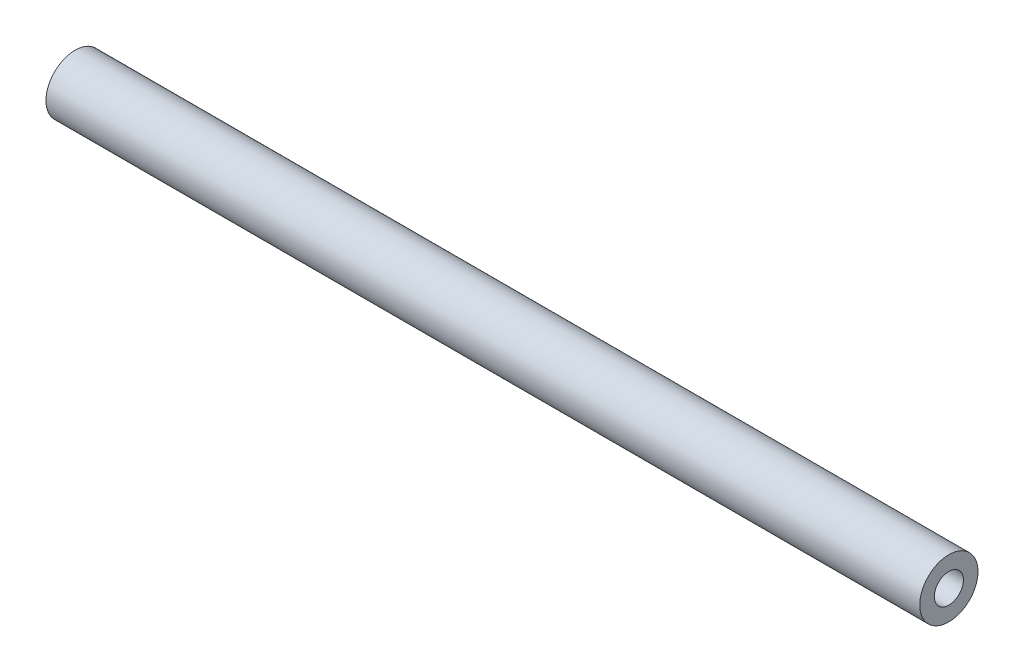
ISO-10303-21;
HEADER;
FILE_DESCRIPTION(('STEP AP214'),'2;1');
FILE_NAME('part.step','',(''),(''),'','','');
FILE_SCHEMA(('AUTOMOTIVE_DESIGN { 1 0 10303 214 1 1 1 1 }'));
ENDSEC;
DATA;
#1=APPLICATION_CONTEXT('core data for automotive mechanical design processes');
#2=APPLICATION_PROTOCOL_DEFINITION('international standard','automotive_design',2000,#1);
#3=PRODUCT_CONTEXT('',#1,'mechanical');
#4=PRODUCT('Part','Part','',(#3));
#5=PRODUCT_RELATED_PRODUCT_CATEGORY('part','',(#4));
#6=PRODUCT_DEFINITION_FORMATION('','',#4);
#7=PRODUCT_DEFINITION_CONTEXT('part definition',#1,'design');
#8=PRODUCT_DEFINITION('design','',#6,#7);
#9=PRODUCT_DEFINITION_SHAPE('','',#8);
#10=(LENGTH_UNIT() NAMED_UNIT(*) SI_UNIT(.MILLI.,.METRE.));
#11=(NAMED_UNIT(*) PLANE_ANGLE_UNIT() SI_UNIT($,.RADIAN.));
#12=(NAMED_UNIT(*) SI_UNIT($,.STERADIAN.) SOLID_ANGLE_UNIT());
#13=UNCERTAINTY_MEASURE_WITH_UNIT(LENGTH_MEASURE(1.E-05),#10,'distance_accuracy_value','');
#14=(GEOMETRIC_REPRESENTATION_CONTEXT(3) GLOBAL_UNCERTAINTY_ASSIGNED_CONTEXT((#13)) GLOBAL_UNIT_ASSIGNED_CONTEXT((#10,
#11,#12)) REPRESENTATION_CONTEXT('',''));
#15=CARTESIAN_POINT('',(0.,0.,0.));
#16=DIRECTION('',(0.,0.,1.));
#17=DIRECTION('',(1.,0.,0.));
#18=AXIS2_PLACEMENT_3D('',#15,#16,#17);
#19=CARTESIAN_POINT('',(75.,0.,0.));
#20=DIRECTION('',(1.,0.,0.));
#21=DIRECTION('',(0.,0.,-1.));
#22=AXIS2_PLACEMENT_3D('',#19,#20,#21);
#23=PLANE('',#22);
#24=CARTESIAN_POINT('',(75.,0.,0.));
#25=DIRECTION('',(1.,0.,0.));
#26=DIRECTION('',(0.,0.,-1.));
#27=AXIS2_PLACEMENT_3D('',#24,#25,#26);
#28=CIRCLE('',#27,5.);
#29=CARTESIAN_POINT('',(75.,0.,-5.));
#30=VERTEX_POINT('',#29);
#31=EDGE_CURVE('E10',#30,#30,#28,.T.);
#32=ORIENTED_EDGE('',*,*,#31,.T.);
#33=EDGE_LOOP('',(#32));
#34=FACE_BOUND('',#33,.T.);
#35=CARTESIAN_POINT('',(75.,0.,0.));
#36=DIRECTION('',(1.,0.,0.));
#37=DIRECTION('',(0.,0.,-1.));
#38=AXIS2_PLACEMENT_3D('',#35,#36,#37);
#39=CIRCLE('',#38,2.5);
#40=CARTESIAN_POINT('',(75.,0.,-2.5));
#41=VERTEX_POINT('',#40);
#42=EDGE_CURVE('E54',#41,#41,#39,.T.);
#43=ORIENTED_EDGE('',*,*,#42,.F.);
#44=EDGE_LOOP('',(#43));
#45=FACE_BOUND('',#44,.T.);
#46=ADVANCED_FACE('F41',(#34,#45),#23,.T.);
#47=CARTESIAN_POINT('',(-75.,0.,0.));
#48=DIRECTION('',(1.,0.,0.));
#49=DIRECTION('',(0.,0.,-1.));
#50=AXIS2_PLACEMENT_3D('',#47,#48,#49);
#51=PLANE('',#50);
#52=CARTESIAN_POINT('',(-75.,0.,0.));
#53=DIRECTION('',(1.,0.,0.));
#54=DIRECTION('',(0.,0.,-1.));
#55=AXIS2_PLACEMENT_3D('',#52,#53,#54);
#56=CIRCLE('',#55,5.);
#57=CARTESIAN_POINT('',(-75.,0.,-5.));
#58=VERTEX_POINT('',#57);
#59=EDGE_CURVE('E45',#58,#58,#56,.T.);
#60=ORIENTED_EDGE('',*,*,#59,.F.);
#61=EDGE_LOOP('',(#60));
#62=FACE_BOUND('',#61,.T.);
#63=CARTESIAN_POINT('',(-75.,0.,0.));
#64=DIRECTION('',(1.,0.,0.));
#65=DIRECTION('',(0.,0.,-1.));
#66=AXIS2_PLACEMENT_3D('',#63,#64,#65);
#67=CIRCLE('',#66,2.5);
#68=CARTESIAN_POINT('',(-75.,0.,-2.5));
#69=VERTEX_POINT('',#68);
#70=EDGE_CURVE('E56',#69,#69,#67,.T.);
#71=ORIENTED_EDGE('',*,*,#70,.T.);
#72=EDGE_LOOP('',(#71));
#73=FACE_BOUND('',#72,.T.);
#74=ADVANCED_FACE('F68',(#62,#73),#51,.F.);
#75=CARTESIAN_POINT('',(75.,0.,0.));
#76=DIRECTION('',(-1.,0.,0.));
#77=DIRECTION('',(0.,0.,1.));
#78=AXIS2_PLACEMENT_3D('',#75,#76,#77);
#79=CYLINDRICAL_SURFACE('',#78,5.);
#80=ORIENTED_EDGE('',*,*,#31,.F.);
#81=EDGE_LOOP('',(#80));
#82=FACE_BOUND('',#81,.T.);
#83=ORIENTED_EDGE('',*,*,#59,.T.);
#84=EDGE_LOOP('',(#83));
#85=FACE_BOUND('',#84,.T.);
#86=ADVANCED_FACE('F43',(#82,#85),#79,.T.);
#87=CARTESIAN_POINT('',(75.,0.,0.));
#88=DIRECTION('',(-1.,0.,0.));
#89=DIRECTION('',(0.,0.,1.));
#90=AXIS2_PLACEMENT_3D('',#87,#88,#89);
#91=CYLINDRICAL_SURFACE('',#90,2.5);
#92=ORIENTED_EDGE('',*,*,#42,.T.);
#93=EDGE_LOOP('',(#92));
#94=FACE_BOUND('',#93,.T.);
#95=ORIENTED_EDGE('',*,*,#70,.F.);
#96=EDGE_LOOP('',(#95));
#97=FACE_BOUND('',#96,.T.);
#98=ADVANCED_FACE('F64',(#94,#97),#91,.F.);
#99=CLOSED_SHELL('',(#46,#74,#86,#98));
#100=MANIFOLD_SOLID_BREP('B2',#99);
#101=ADVANCED_BREP_SHAPE_REPRESENTATION('',(#18,#100),#14);
#102=SHAPE_DEFINITION_REPRESENTATION(#9,#101);
ENDSEC;
END-ISO-10303-21;
